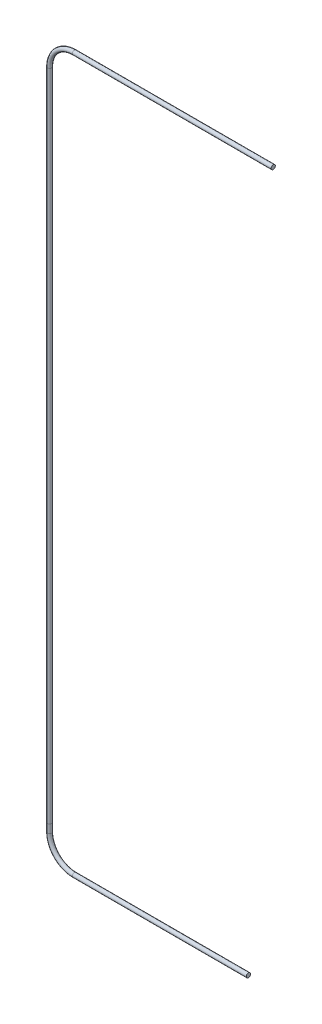
ISO-10303-21;
HEADER;
FILE_DESCRIPTION(('STEP AP214'),'2;1');
FILE_NAME('part.step','',(''),(''),'','','');
FILE_SCHEMA(('AUTOMOTIVE_DESIGN { 1 0 10303 214 1 1 1 1 }'));
ENDSEC;
DATA;
#1=APPLICATION_CONTEXT('core data for automotive mechanical design processes');
#2=APPLICATION_PROTOCOL_DEFINITION('international standard','automotive_design',2000,#1);
#3=PRODUCT_CONTEXT('',#1,'mechanical');
#4=PRODUCT('Part','Part','',(#3));
#5=PRODUCT_RELATED_PRODUCT_CATEGORY('part','',(#4));
#6=PRODUCT_DEFINITION_FORMATION('','',#4);
#7=PRODUCT_DEFINITION_CONTEXT('part definition',#1,'design');
#8=PRODUCT_DEFINITION('design','',#6,#7);
#9=PRODUCT_DEFINITION_SHAPE('','',#8);
#10=(LENGTH_UNIT() NAMED_UNIT(*) SI_UNIT(.MILLI.,.METRE.));
#11=(NAMED_UNIT(*) PLANE_ANGLE_UNIT() SI_UNIT($,.RADIAN.));
#12=(NAMED_UNIT(*) SI_UNIT($,.STERADIAN.) SOLID_ANGLE_UNIT());
#13=UNCERTAINTY_MEASURE_WITH_UNIT(LENGTH_MEASURE(1.E-05),#10,'distance_accuracy_value','');
#14=(GEOMETRIC_REPRESENTATION_CONTEXT(3) GLOBAL_UNCERTAINTY_ASSIGNED_CONTEXT((#13)) GLOBAL_UNIT_ASSIGNED_CONTEXT((#10,
#11,#12)) REPRESENTATION_CONTEXT('',''));
#15=CARTESIAN_POINT('',(0.,0.,0.));
#16=DIRECTION('',(0.,0.,1.));
#17=DIRECTION('',(1.,0.,0.));
#18=AXIS2_PLACEMENT_3D('',#15,#16,#17);
#19=CARTESIAN_POINT('',(599.999999999997,-99.999999999995,-6.93889390390723E-12));
#20=DIRECTION('',(1.,0.,0.));
#21=DIRECTION('',(0.,0.,1.));
#22=AXIS2_PLACEMENT_3D('',#19,#20,#21);
#23=PLANE('',#22);
#24=CARTESIAN_POINT('',(599.999999999997,-99.999999999995,-6.93889390390723E-12));
#25=DIRECTION('',(1.,0.,0.));
#26=DIRECTION('',(0.,0.,1.));
#27=AXIS2_PLACEMENT_3D('',#24,#25,#26);
#28=CIRCLE('',#27,6.35);
#29=CARTESIAN_POINT('',(599.999999999997,-99.999999999995,6.34999999999307));
#30=VERTEX_POINT('',#29);
#31=EDGE_CURVE('E79',#30,#30,#28,.T.);
#32=ORIENTED_EDGE('',*,*,#31,.T.);
#33=EDGE_LOOP('',(#32));
#34=FACE_BOUND('',#33,.T.);
#35=ADVANCED_FACE('F46',(#34),#23,.T.);
#36=CARTESIAN_POINT('',(675.000000000003,2050.,6.38378239159465E-12));
#37=DIRECTION('',(-1.,0.,0.));
#38=DIRECTION('',(0.,0.,1.));
#39=AXIS2_PLACEMENT_3D('',#36,#37,#38);
#40=PLANE('',#39);
#41=CARTESIAN_POINT('',(675.000000000003,2050.,6.38378239159465E-12));
#42=DIRECTION('',(-1.,0.,0.));
#43=DIRECTION('',(0.,0.,1.));
#44=AXIS2_PLACEMENT_3D('',#41,#42,#43);
#45=CIRCLE('',#44,6.35);
#46=CARTESIAN_POINT('',(675.000000000003,2050.,6.35000000000639));
#47=VERTEX_POINT('',#46);
#48=EDGE_CURVE('E11',#47,#47,#45,.T.);
#49=ORIENTED_EDGE('',*,*,#48,.F.);
#50=EDGE_LOOP('',(#49));
#51=FACE_BOUND('',#50,.T.);
#52=ADVANCED_FACE('F89',(#51),#40,.F.);
#53=CARTESIAN_POINT('',(599.999999999997,-99.999999999995,-6.93889390390723E-12));
#54=DIRECTION('',(-1.,0.,0.));
#55=DIRECTION('',(0.,0.,1.));
#56=AXIS2_PLACEMENT_3D('',#53,#54,#55);
#57=CYLINDRICAL_SURFACE('',#56,6.35);
#58=CARTESIAN_POINT('',(75.0000000000002,-99.999999999999,-5.32907051820075E-12));
#59=DIRECTION('',(1.,0.,0.));
#60=DIRECTION('',(0.,0.,1.));
#61=AXIS2_PLACEMENT_3D('',#58,#59,#60);
#62=CIRCLE('',#61,6.35);
#63=CARTESIAN_POINT('',(75.0000000000002,-106.349999999999,-5.63456688714346E-12));
#64=VERTEX_POINT('',#63);
#65=EDGE_CURVE('E75',#64,#64,#62,.T.);
#66=ORIENTED_EDGE('',*,*,#65,.T.);
#67=EDGE_LOOP('',(#66));
#68=FACE_BOUND('',#67,.T.);
#69=ORIENTED_EDGE('',*,*,#31,.F.);
#70=EDGE_LOOP('',(#69));
#71=FACE_BOUND('',#70,.T.);
#72=ADVANCED_FACE('F86',(#68,#71),#57,.T.);
#73=CARTESIAN_POINT('',(75.0000000000004,-24.9999999999994,-1.72084568816899E-12));
#74=DIRECTION('',(0.,0.,-1.));
#75=DIRECTION('',(-1.,0.,0.));
#76=AXIS2_PLACEMENT_3D('',#73,#74,#75);
#77=TOROIDAL_SURFACE('',#76,75.0000000000001,6.35);
#78=CARTESIAN_POINT('',(1.33226762955019E-12,-24.9999999999972,-1.19973475598556E-11));
#79=DIRECTION('',(0.,-0.999999999999999,0.));
#80=DIRECTION('',(0.,0.,1.));
#81=AXIS2_PLACEMENT_3D('',#78,#79,#80);
#82=CIRCLE('',#81,6.35);
#83=CARTESIAN_POINT('',(-6.34999999999965,-24.9999999999971,-1.28674247183252E-11));
#84=VERTEX_POINT('',#83);
#85=EDGE_CURVE('E71',#84,#84,#82,.T.);
#86=CARTESIAN_POINT('',(75.0000000000004,-24.9999999999994,-1.72084568816899E-12));
#87=DIRECTION('',(0.,0.,-1.));
#88=DIRECTION('',(-1.,0.,0.));
#89=AXIS2_PLACEMENT_3D('',#86,#87,#88);
#90=CIRCLE('',#89,81.3500000000001);
#91=EDGE_CURVE('',#64,#84,#90,.T.);
#92=ORIENTED_EDGE('',*,*,#65,.F.);
#93=ORIENTED_EDGE('',*,*,#85,.T.);
#94=ORIENTED_EDGE('',*,*,#91,.T.);
#95=ORIENTED_EDGE('',*,*,#91,.F.);
#96=EDGE_LOOP('',(#92,#94,#93,#95));
#97=FACE_BOUND('',#96,.T.);
#98=ADVANCED_FACE('F88',(#97),#77,.T.);
#99=CARTESIAN_POINT('',(1.33226762955019E-12,-24.9999999999972,-1.19973475598556E-11));
#100=DIRECTION('',(0.,0.999999999999999,0.));
#101=DIRECTION('',(-1.,0.,0.));
#102=AXIS2_PLACEMENT_3D('',#99,#100,#101);
#103=CYLINDRICAL_SURFACE('',#102,6.35);
#104=CARTESIAN_POINT('',(0.,0.,0.));
#105=DIRECTION('',(0.,-0.999999999999999,0.));
#106=DIRECTION('',(0.,0.,1.));
#107=AXIS2_PLACEMENT_3D('',#104,#105,#106);
#108=CIRCLE('',#107,6.35);
#109=CARTESIAN_POINT('',(-6.34999999999857,0.,-1.18920984171211E-11));
#110=VERTEX_POINT('',#109);
#111=EDGE_CURVE('E65',#110,#110,#108,.T.);
#112=CARTESIAN_POINT('',(-6.34999999999857,0.,-1.18920984171211E-11));
#113=CARTESIAN_POINT('',(-6.34999999999858,-0.260416666666614,-1.18933416356123E-11));
#114=CARTESIAN_POINT('',(-6.34999999999858,-0.520833333333252,-1.18945848541034E-11));
#115=CARTESIAN_POINT('',(-6.34999999999858,-1.04166666666653,-1.18970712910856E-11));
#116=CARTESIAN_POINT('',(-6.34999999999858,-1.30208333333317,-1.18983145095767E-11));
#117=CARTESIAN_POINT('',(-6.34999999999858,-1.82291666666644,-1.1900800946559E-11));
#118=CARTESIAN_POINT('',(-6.34999999999858,-2.08333333333308,-1.19020441650501E-11));
#119=CARTESIAN_POINT('',(-6.34999999999858,-2.60416666666636,-1.19045306020323E-11));
#120=CARTESIAN_POINT('',(-6.34999999999858,-2.86458333333299,-1.19057738205234E-11));
#121=CARTESIAN_POINT('',(-6.34999999999859,-3.38541666666627,-1.19082602575057E-11));
#122=CARTESIAN_POINT('',(-6.34999999999859,-3.64583333333291,-1.19095034759968E-11));
#123=CARTESIAN_POINT('',(-6.34999999999859,-4.16666666666618,-1.1911989912979E-11));
#124=CARTESIAN_POINT('',(-6.34999999999859,-4.42708333333282,-1.19132331314701E-11));
#125=CARTESIAN_POINT('',(-6.34999999999859,-4.9479166666661,-1.19157195684524E-11));
#126=CARTESIAN_POINT('',(-6.34999999999859,-5.20833333333274,-1.19169627869435E-11));
#127=CARTESIAN_POINT('',(-6.34999999999859,-5.72916666666601,-1.19194492239257E-11));
#128=CARTESIAN_POINT('',(-6.3499999999986,-5.98958333333265,-1.19206924424168E-11));
#129=CARTESIAN_POINT('',(-6.3499999999986,-6.51041666666593,-1.19231788793991E-11));
#130=CARTESIAN_POINT('',(-6.3499999999986,-6.77083333333256,-1.19244220978902E-11));
#131=CARTESIAN_POINT('',(-6.3499999999986,-7.29166666666584,-1.19269085348724E-11));
#132=CARTESIAN_POINT('',(-6.3499999999986,-7.55208333333248,-1.19281517533635E-11));
#133=CARTESIAN_POINT('',(-6.3499999999986,-8.07291666666575,-1.19306381903458E-11));
#134=CARTESIAN_POINT('',(-6.34999999999861,-8.33333333333239,-1.19318814088369E-11));
#135=CARTESIAN_POINT('',(-6.34999999999861,-8.85416666666567,-1.19343678458191E-11));
#136=CARTESIAN_POINT('',(-6.34999999999861,-9.11458333333231,-1.19356110643102E-11));
#137=CARTESIAN_POINT('',(-6.34999999999861,-9.63541666666558,-1.19380975012925E-11));
#138=CARTESIAN_POINT('',(-6.34999999999861,-9.89583333333222,-1.19393407197836E-11));
#139=CARTESIAN_POINT('',(-6.34999999999861,-10.4166666666655,-1.19418271567658E-11));
#140=CARTESIAN_POINT('',(-6.34999999999861,-10.6770833333321,-1.19430703752569E-11));
#141=CARTESIAN_POINT('',(-6.34999999999862,-11.1979166666654,-1.19455568122392E-11));
#142=CARTESIAN_POINT('',(-6.34999999999862,-11.458333333332,-1.19468000307303E-11));
#143=CARTESIAN_POINT('',(-6.34999999999862,-11.9791666666653,-1.19492864677125E-11));
#144=CARTESIAN_POINT('',(-6.34999999999862,-12.239583333332,-1.19505296862036E-11));
#145=CARTESIAN_POINT('',(-6.34999999999862,-12.7604166666652,-1.19530161231859E-11));
#146=CARTESIAN_POINT('',(-6.34999999999862,-13.0208333333319,-1.1954259341677E-11));
#147=CARTESIAN_POINT('',(-6.34999999999862,-13.5416666666652,-1.19567457786592E-11));
#148=CARTESIAN_POINT('',(-6.34999999999863,-13.8020833333318,-1.19579889971503E-11));
#149=CARTESIAN_POINT('',(-6.34999999999863,-14.3229166666651,-1.19604754341326E-11));
#150=CARTESIAN_POINT('',(-6.34999999999863,-14.5833333333317,-1.19617186526237E-11));
#151=CARTESIAN_POINT('',(-6.34999999999863,-15.104166666665,-1.19642050896059E-11));
#152=CARTESIAN_POINT('',(-6.34999999999863,-15.3645833333316,-1.1965448308097E-11));
#153=CARTESIAN_POINT('',(-6.34999999999863,-15.8854166666649,-1.19679347450793E-11));
#154=CARTESIAN_POINT('',(-6.34999999999863,-16.1458333333315,-1.19691779635704E-11));
#155=CARTESIAN_POINT('',(-6.34999999999864,-16.6666666666648,-1.19716644005526E-11));
#156=CARTESIAN_POINT('',(-6.34999999999864,-16.9270833333314,-1.19729076190437E-11));
#157=CARTESIAN_POINT('',(-6.34999999999864,-17.4479166666647,-1.1975394056026E-11));
#158=CARTESIAN_POINT('',(-6.34999999999864,-17.7083333333314,-1.19766372745171E-11));
#159=CARTESIAN_POINT('',(-6.34999999999864,-18.2291666666646,-1.19791237114993E-11));
#160=CARTESIAN_POINT('',(-6.34999999999864,-18.4895833333313,-1.19803669299904E-11));
#161=CARTESIAN_POINT('',(-6.34999999999865,-19.0104166666646,-1.19828533669727E-11));
#162=CARTESIAN_POINT('',(-6.34999999999865,-19.2708333333312,-1.19840965854638E-11));
#163=CARTESIAN_POINT('',(-6.34999999999865,-19.7916666666645,-1.1986583022446E-11));
#164=CARTESIAN_POINT('',(-6.34999999999865,-20.0520833333311,-1.19878262409371E-11));
#165=CARTESIAN_POINT('',(-6.34999999999865,-20.5729166666644,-1.19903126779194E-11));
#166=CARTESIAN_POINT('',(-6.34999999999865,-20.833333333331,-1.19915558964105E-11));
#167=CARTESIAN_POINT('',(-6.34999999999865,-21.3541666666643,-1.19940423333927E-11));
#168=CARTESIAN_POINT('',(-6.34999999999865,-21.6145833333309,-1.19952855518838E-11));
#169=CARTESIAN_POINT('',(-6.34999999999866,-22.1354166666642,-1.19977719888661E-11));
#170=CARTESIAN_POINT('',(-6.34999999999866,-22.3958333333308,-1.19990152073572E-11));
#171=CARTESIAN_POINT('',(-6.34999999999866,-22.9166666666641,-1.20015016443394E-11));
#172=CARTESIAN_POINT('',(-6.34999999999866,-23.1770833333308,-1.20027448628305E-11));
#173=CARTESIAN_POINT('',(-6.34999999999866,-23.697916666664,-1.20052312998128E-11));
#174=CARTESIAN_POINT('',(-6.34999999999866,-23.9583333333307,-1.20064745183039E-11));
#175=CARTESIAN_POINT('',(-6.34999999999867,-24.479166666664,-1.20089609552861E-11));
#176=CARTESIAN_POINT('',(-6.34999999999867,-24.7395833333306,-1.20102041737772E-11));
#177=CARTESIAN_POINT('',(-6.34999999999867,-24.9999999999972,-1.20114473922683E-11));
#178=B_SPLINE_CURVE_WITH_KNOTS('',3,(#112,#113,#114,#115,#116,#117,#118,#119,#120,#121,#122,
#123,#124,#125,#126,#127,#128,#129,#130,#131,#132,#133,#134,#135,#136,#137,#138,#139,#140,#141,
#142,#143,#144,#145,#146,#147,#148,#149,#150,#151,#152,#153,#154,#155,#156,#157,#158,#159,#160,
#161,#162,#163,#164,#165,#166,#167,#168,#169,#170,#171,#172,#173,#174,#175,#176,#177),
.UNSPECIFIED.,.F.,.F.,(4,2,2,2,2,2,2,2,2,2,2,2,2,2,2,2,2,2,2,2,2,2,2,2,2,2,2,2,2,2,2,2,4),(0.,
0.781249999999914,1.56249999999983,2.34374999999974,3.12499999999966,3.90624999999957,
4.68749999999948,5.4687499999994,6.24999999999931,7.03124999999923,7.81249999999914,
8.59374999999906,9.37499999999897,10.1562499999989,10.9374999999988,11.7187499999987,
12.4999999999986,13.2812499999985,14.0624999999985,14.8437499999984,15.6249999999983,
16.4062499999982,17.1874999999981,17.968749999998,18.7499999999979,19.5312499999979,
20.3124999999978,21.0937499999977,21.8749999999976,22.6562499999975,23.4374999999974,
24.2187499999973,24.9999999999973),.UNSPECIFIED.);
#179=EDGE_CURVE('BSEAM96',#110,#84,#178,.T.);
#180=ORIENTED_EDGE('',*,*,#111,.T.);
#181=ORIENTED_EDGE('',*,*,#85,.F.);
#182=ORIENTED_EDGE('',*,*,#179,.T.);
#183=ORIENTED_EDGE('',*,*,#179,.F.);
#184=EDGE_LOOP('',(#180,#182,#181,#183));
#185=FACE_BOUND('',#184,.T.);
#186=ADVANCED_FACE('F96',(#185),#103,.T.);
#187=CARTESIAN_POINT('',(0.,0.,0.));
#188=DIRECTION('',(0.,0.999999999999999,0.));
#189=DIRECTION('',(0.,0.,1.));
#190=AXIS2_PLACEMENT_3D('',#187,#188,#189);
#191=CYLINDRICAL_SURFACE('',#190,6.35);
#192=CARTESIAN_POINT('',(2.44249065417534E-12,1975.,4.42701431069281E-12));
#193=DIRECTION('',(0.,-0.999999999999999,0.));
#194=DIRECTION('',(0.,0.,1.));
#195=AXIS2_PLACEMENT_3D('',#192,#193,#194);
#196=CIRCLE('',#195,6.35);
#197=CARTESIAN_POINT('',(-6.34999999999734,1975.,4.69138616843167E-12));
#198=VERTEX_POINT('',#197);
#199=EDGE_CURVE('E59',#198,#198,#196,.T.);
#200=ORIENTED_EDGE('',*,*,#199,.T.);
#201=EDGE_LOOP('',(#200));
#202=FACE_BOUND('',#201,.T.);
#203=ORIENTED_EDGE('',*,*,#111,.F.);
#204=EDGE_LOOP('',(#203));
#205=FACE_BOUND('',#204,.T.);
#206=ADVANCED_FACE('F107',(#202,#205),#191,.T.);
#207=CARTESIAN_POINT('',(75.0000000000022,1975.,1.30451205393456E-12));
#208=DIRECTION('',(0.,0.,-1.));
#209=DIRECTION('',(-1.,0.,0.));
#210=AXIS2_PLACEMENT_3D('',#207,#208,#209);
#211=TOROIDAL_SURFACE('',#210,74.9999999999996,6.35);
#212=CARTESIAN_POINT('',(75.0000000000104,2050.,4.85722573273506E-13));
#213=DIRECTION('',(-1.,0.,0.));
#214=DIRECTION('',(0.,0.,1.));
#215=AXIS2_PLACEMENT_3D('',#212,#213,#214);
#216=CIRCLE('',#215,6.35);
#217=CARTESIAN_POINT('',(75.0000000000111,2056.35,4.16398397244224E-13));
#218=VERTEX_POINT('',#217);
#219=EDGE_CURVE('E53',#218,#218,#216,.T.);
#220=CARTESIAN_POINT('',(75.0000000000022,1975.,1.30451205393456E-12));
#221=DIRECTION('',(0.,0.,-1.));
#222=DIRECTION('',(-1.,0.,0.));
#223=AXIS2_PLACEMENT_3D('',#220,#221,#222);
#224=CIRCLE('',#223,81.3499999999996);
#225=EDGE_CURVE('',#198,#218,#224,.T.);
#226=ORIENTED_EDGE('',*,*,#199,.F.);
#227=ORIENTED_EDGE('',*,*,#219,.T.);
#228=ORIENTED_EDGE('',*,*,#225,.T.);
#229=ORIENTED_EDGE('',*,*,#225,.F.);
#230=EDGE_LOOP('',(#226,#228,#227,#229));
#231=FACE_BOUND('',#230,.T.);
#232=ADVANCED_FACE('F102',(#231),#211,.T.);
#233=CARTESIAN_POINT('',(75.0000000000126,2050.,8.88178419700125E-13));
#234=DIRECTION('',(1.,0.,0.));
#235=DIRECTION('',(0.,0.,-1.));
#236=AXIS2_PLACEMENT_3D('',#233,#234,#235);
#237=CYLINDRICAL_SURFACE('',#236,6.35);
#238=ORIENTED_EDGE('',*,*,#48,.T.);
#239=EDGE_LOOP('',(#238));
#240=FACE_BOUND('',#239,.T.);
#241=ORIENTED_EDGE('',*,*,#219,.F.);
#242=EDGE_LOOP('',(#241));
#243=FACE_BOUND('',#242,.T.);
#244=ADVANCED_FACE('F100',(#240,#243),#237,.T.);
#245=CLOSED_SHELL('',(#35,#52,#72,#98,#186,#206,#232,#244));
#246=MANIFOLD_SOLID_BREP('B2',#245);
#247=ADVANCED_BREP_SHAPE_REPRESENTATION('',(#18,#246),#14);
#248=SHAPE_DEFINITION_REPRESENTATION(#9,#247);
ENDSEC;
END-ISO-10303-21;
